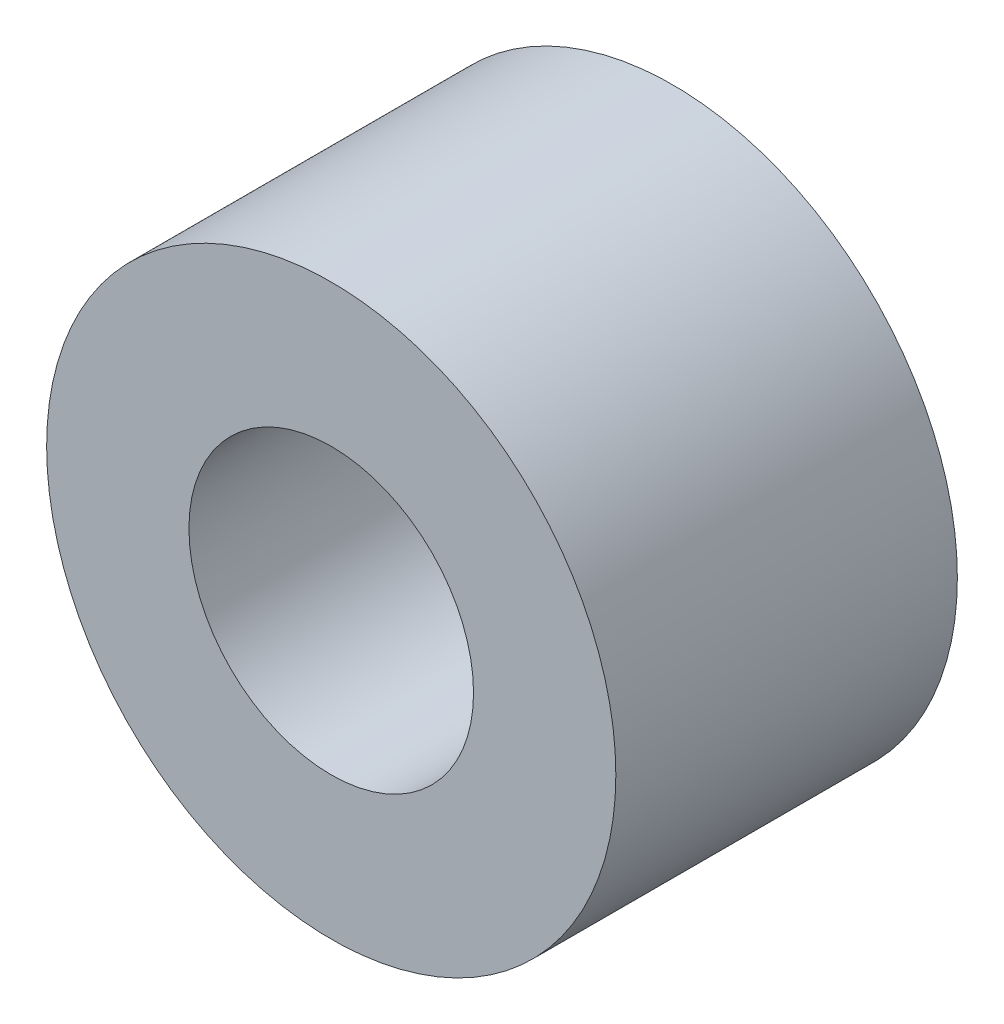
ISO-10303-21;
HEADER;
FILE_DESCRIPTION(('STEP AP214'),'2;1');
FILE_NAME('part.step','',(''),(''),'','','');
FILE_SCHEMA(('AUTOMOTIVE_DESIGN { 1 0 10303 214 1 1 1 1 }'));
ENDSEC;
DATA;
#1=APPLICATION_CONTEXT('core data for automotive mechanical design processes');
#2=APPLICATION_PROTOCOL_DEFINITION('international standard','automotive_design',2000,#1);
#3=PRODUCT_CONTEXT('',#1,'mechanical');
#4=PRODUCT('Part','Part','',(#3));
#5=PRODUCT_RELATED_PRODUCT_CATEGORY('part','',(#4));
#6=PRODUCT_DEFINITION_FORMATION('','',#4);
#7=PRODUCT_DEFINITION_CONTEXT('part definition',#1,'design');
#8=PRODUCT_DEFINITION('design','',#6,#7);
#9=PRODUCT_DEFINITION_SHAPE('','',#8);
#10=(LENGTH_UNIT() NAMED_UNIT(*) SI_UNIT(.MILLI.,.METRE.));
#11=(NAMED_UNIT(*) PLANE_ANGLE_UNIT() SI_UNIT($,.RADIAN.));
#12=(NAMED_UNIT(*) SI_UNIT($,.STERADIAN.) SOLID_ANGLE_UNIT());
#13=UNCERTAINTY_MEASURE_WITH_UNIT(LENGTH_MEASURE(1.E-05),#10,'distance_accuracy_value','');
#14=(GEOMETRIC_REPRESENTATION_CONTEXT(3) GLOBAL_UNCERTAINTY_ASSIGNED_CONTEXT((#13)) GLOBAL_UNIT_ASSIGNED_CONTEXT((#10,
#11,#12)) REPRESENTATION_CONTEXT('',''));
#15=CARTESIAN_POINT('',(0.,0.,0.));
#16=DIRECTION('',(0.,0.,1.));
#17=DIRECTION('',(1.,0.,0.));
#18=AXIS2_PLACEMENT_3D('',#15,#16,#17);
#19=CARTESIAN_POINT('',(0.,0.,6.));
#20=DIRECTION('',(0.,0.,1.));
#21=DIRECTION('',(1.,0.,0.));
#22=AXIS2_PLACEMENT_3D('',#19,#20,#21);
#23=PLANE('',#22);
#24=CARTESIAN_POINT('',(0.,0.,6.));
#25=DIRECTION('',(0.,0.,1.));
#26=DIRECTION('',(1.,0.,0.));
#27=AXIS2_PLACEMENT_3D('',#24,#25,#26);
#28=CIRCLE('',#27,5.);
#29=CARTESIAN_POINT('',(5.,0.,6.));
#30=VERTEX_POINT('',#29);
#31=EDGE_CURVE('E10',#30,#30,#28,.T.);
#32=ORIENTED_EDGE('',*,*,#31,.T.);
#33=EDGE_LOOP('',(#32));
#34=FACE_BOUND('',#33,.T.);
#35=CARTESIAN_POINT('',(0.,0.,6.));
#36=DIRECTION('',(0.,0.,1.));
#37=DIRECTION('',(1.,0.,0.));
#38=AXIS2_PLACEMENT_3D('',#35,#36,#37);
#39=CIRCLE('',#38,2.5);
#40=CARTESIAN_POINT('',(2.5,0.,6.));
#41=VERTEX_POINT('',#40);
#42=EDGE_CURVE('E50',#41,#41,#39,.T.);
#43=ORIENTED_EDGE('',*,*,#42,.F.);
#44=EDGE_LOOP('',(#43));
#45=FACE_BOUND('',#44,.T.);
#46=ADVANCED_FACE('F37',(#34,#45),#23,.T.);
#47=CARTESIAN_POINT('',(0.,0.,0.));
#48=DIRECTION('',(0.,0.,1.));
#49=DIRECTION('',(1.,0.,0.));
#50=AXIS2_PLACEMENT_3D('',#47,#48,#49);
#51=PLANE('',#50);
#52=CARTESIAN_POINT('',(0.,0.,0.));
#53=DIRECTION('',(0.,0.,1.));
#54=DIRECTION('',(1.,0.,0.));
#55=AXIS2_PLACEMENT_3D('',#52,#53,#54);
#56=CIRCLE('',#55,5.);
#57=CARTESIAN_POINT('',(5.,0.,0.));
#58=VERTEX_POINT('',#57);
#59=EDGE_CURVE('E41',#58,#58,#56,.T.);
#60=ORIENTED_EDGE('',*,*,#59,.F.);
#61=EDGE_LOOP('',(#60));
#62=FACE_BOUND('',#61,.T.);
#63=CARTESIAN_POINT('',(0.,0.,0.));
#64=DIRECTION('',(0.,0.,1.));
#65=DIRECTION('',(1.,0.,0.));
#66=AXIS2_PLACEMENT_3D('',#63,#64,#65);
#67=CIRCLE('',#66,2.5);
#68=CARTESIAN_POINT('',(2.5,0.,0.));
#69=VERTEX_POINT('',#68);
#70=EDGE_CURVE('E52',#69,#69,#67,.T.);
#71=ORIENTED_EDGE('',*,*,#70,.T.);
#72=EDGE_LOOP('',(#71));
#73=FACE_BOUND('',#72,.T.);
#74=ADVANCED_FACE('F64',(#62,#73),#51,.F.);
#75=CARTESIAN_POINT('',(0.,0.,6.));
#76=DIRECTION('',(0.,0.,-1.));
#77=DIRECTION('',(-1.,0.,0.));
#78=AXIS2_PLACEMENT_3D('',#75,#76,#77);
#79=CYLINDRICAL_SURFACE('',#78,5.);
#80=ORIENTED_EDGE('',*,*,#31,.F.);
#81=EDGE_LOOP('',(#80));
#82=FACE_BOUND('',#81,.T.);
#83=ORIENTED_EDGE('',*,*,#59,.T.);
#84=EDGE_LOOP('',(#83));
#85=FACE_BOUND('',#84,.T.);
#86=ADVANCED_FACE('F39',(#82,#85),#79,.T.);
#87=CARTESIAN_POINT('',(0.,0.,6.));
#88=DIRECTION('',(0.,0.,-1.));
#89=DIRECTION('',(-1.,0.,0.));
#90=AXIS2_PLACEMENT_3D('',#87,#88,#89);
#91=CYLINDRICAL_SURFACE('',#90,2.5);
#92=ORIENTED_EDGE('',*,*,#42,.T.);
#93=EDGE_LOOP('',(#92));
#94=FACE_BOUND('',#93,.T.);
#95=ORIENTED_EDGE('',*,*,#70,.F.);
#96=EDGE_LOOP('',(#95));
#97=FACE_BOUND('',#96,.T.);
#98=ADVANCED_FACE('F60',(#94,#97),#91,.F.);
#99=CLOSED_SHELL('',(#46,#74,#86,#98));
#100=MANIFOLD_SOLID_BREP('B2',#99);
#101=ADVANCED_BREP_SHAPE_REPRESENTATION('',(#18,#100),#14);
#102=SHAPE_DEFINITION_REPRESENTATION(#9,#101);
ENDSEC;
END-ISO-10303-21;
